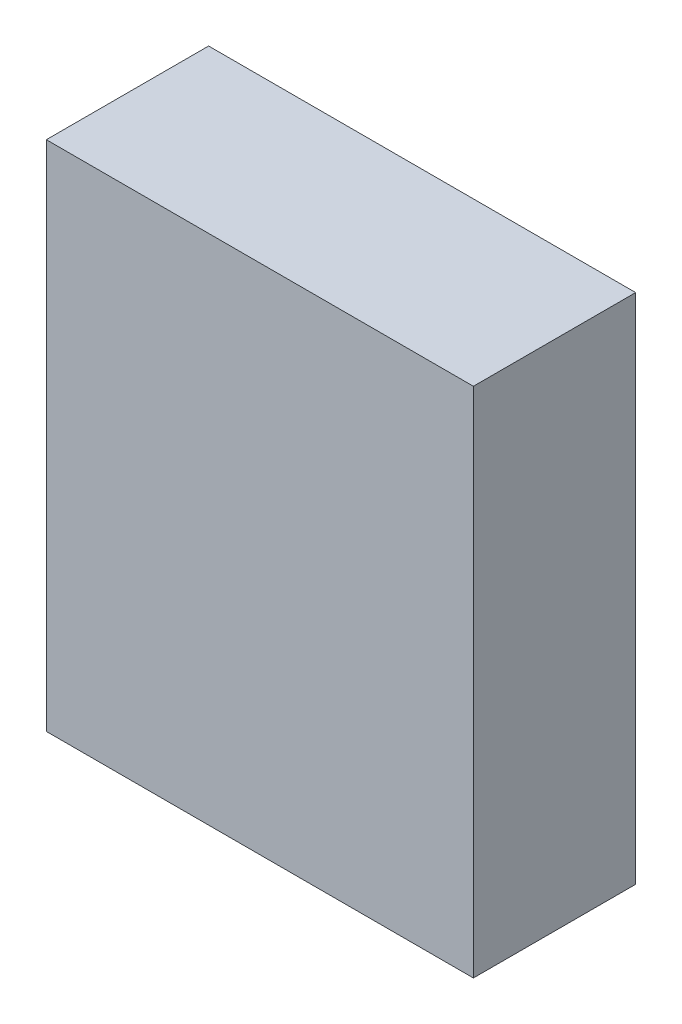
ISO-10303-21;
HEADER;
FILE_DESCRIPTION(('STEP AP214'),'2;1');
FILE_NAME('part.step','',(''),(''),'','','');
FILE_SCHEMA(('AUTOMOTIVE_DESIGN { 1 0 10303 214 1 1 1 1 }'));
ENDSEC;
DATA;
#1=APPLICATION_CONTEXT('core data for automotive mechanical design processes');
#2=APPLICATION_PROTOCOL_DEFINITION('international standard','automotive_design',2000,#1);
#3=PRODUCT_CONTEXT('',#1,'mechanical');
#4=PRODUCT('Part','Part','',(#3));
#5=PRODUCT_RELATED_PRODUCT_CATEGORY('part','',(#4));
#6=PRODUCT_DEFINITION_FORMATION('','',#4);
#7=PRODUCT_DEFINITION_CONTEXT('part definition',#1,'design');
#8=PRODUCT_DEFINITION('design','',#6,#7);
#9=PRODUCT_DEFINITION_SHAPE('','',#8);
#10=(LENGTH_UNIT() NAMED_UNIT(*) SI_UNIT(.MILLI.,.METRE.));
#11=(NAMED_UNIT(*) PLANE_ANGLE_UNIT() SI_UNIT($,.RADIAN.));
#12=(NAMED_UNIT(*) SI_UNIT($,.STERADIAN.) SOLID_ANGLE_UNIT());
#13=UNCERTAINTY_MEASURE_WITH_UNIT(LENGTH_MEASURE(1.E-05),#10,'distance_accuracy_value','');
#14=(GEOMETRIC_REPRESENTATION_CONTEXT(3) GLOBAL_UNCERTAINTY_ASSIGNED_CONTEXT((#13)) GLOBAL_UNIT_ASSIGNED_CONTEXT((#10,
#11,#12)) REPRESENTATION_CONTEXT('',''));
#15=CARTESIAN_POINT('',(0.,0.,0.));
#16=DIRECTION('',(0.,0.,1.));
#17=DIRECTION('',(1.,0.,0.));
#18=AXIS2_PLACEMENT_3D('',#15,#16,#17);
#19=CARTESIAN_POINT('',(-1.905,2.286,0.));
#20=DIRECTION('',(0.,0.,-1.));
#21=DIRECTION('',(-1.,0.,0.));
#22=AXIS2_PLACEMENT_3D('',#19,#20,#21);
#23=PLANE('',#22);
#24=DIRECTION('',(0.,1.,0.));
#25=VECTOR('',#24,1.);
#26=CARTESIAN_POINT('',(1.905,2.286,0.));
#27=LINE('',#26,#25);
#28=CARTESIAN_POINT('',(1.905,-2.286,0.));
#29=VERTEX_POINT('',#28);
#30=CARTESIAN_POINT('',(1.905,2.286,0.));
#31=VERTEX_POINT('',#30);
#32=EDGE_CURVE('E54',#29,#31,#27,.T.);
#33=ORIENTED_EDGE('',*,*,#32,.F.);
#34=DIRECTION('',(1.,0.,0.));
#35=VECTOR('',#34,1.);
#36=CARTESIAN_POINT('',(1.905,-2.286,0.));
#37=LINE('',#36,#35);
#38=CARTESIAN_POINT('',(-1.905,-2.286,0.));
#39=VERTEX_POINT('',#38);
#40=EDGE_CURVE('E19',#39,#29,#37,.T.);
#41=ORIENTED_EDGE('',*,*,#40,.F.);
#42=DIRECTION('',(0.,1.,0.));
#43=VECTOR('',#42,1.);
#44=CARTESIAN_POINT('',(-1.905,-2.286,0.));
#45=LINE('',#44,#43);
#46=CARTESIAN_POINT('',(-1.905,2.286,0.));
#47=VERTEX_POINT('',#46);
#48=EDGE_CURVE('E79',#47,#39,#45,.F.);
#49=ORIENTED_EDGE('',*,*,#48,.F.);
#50=DIRECTION('',(1.,0.,0.));
#51=VECTOR('',#50,1.);
#52=CARTESIAN_POINT('',(-1.905,2.286,0.));
#53=LINE('',#52,#51);
#54=EDGE_CURVE('E67',#31,#47,#53,.F.);
#55=ORIENTED_EDGE('',*,*,#54,.F.);
#56=EDGE_LOOP('',(#33,#41,#49,#55));
#57=FACE_BOUND('',#56,.T.);
#58=ADVANCED_FACE('F16',(#57),#23,.T.);
#59=CARTESIAN_POINT('',(1.905,-2.286,1.4478));
#60=DIRECTION('',(0.,-1.,0.));
#61=DIRECTION('',(0.,0.,-1.));
#62=AXIS2_PLACEMENT_3D('',#59,#60,#61);
#63=PLANE('',#62);
#64=ORIENTED_EDGE('',*,*,#40,.T.);
#65=DIRECTION('',(0.,0.,-1.));
#66=VECTOR('',#65,1.);
#67=CARTESIAN_POINT('',(1.905,-2.286,1.4478));
#68=LINE('',#67,#66);
#69=CARTESIAN_POINT('',(1.905,-2.286,1.4478));
#70=VERTEX_POINT('',#69);
#71=EDGE_CURVE('E60',#70,#29,#68,.T.);
#72=ORIENTED_EDGE('',*,*,#71,.F.);
#73=DIRECTION('',(1.,0.,0.));
#74=VECTOR('',#73,1.);
#75=CARTESIAN_POINT('',(-1.905,-2.286,1.4478));
#76=LINE('',#75,#74);
#77=CARTESIAN_POINT('',(-1.905,-2.286,1.4478));
#78=VERTEX_POINT('',#77);
#79=EDGE_CURVE('E82',#78,#70,#76,.T.);
#80=ORIENTED_EDGE('',*,*,#79,.F.);
#81=DIRECTION('',(0.,0.,1.));
#82=VECTOR('',#81,1.);
#83=CARTESIAN_POINT('',(-1.905,-2.286,1.4478));
#84=LINE('',#83,#82);
#85=EDGE_CURVE('E63',#39,#78,#84,.T.);
#86=ORIENTED_EDGE('',*,*,#85,.F.);
#87=EDGE_LOOP('',(#64,#72,#80,#86));
#88=FACE_BOUND('',#87,.T.);
#89=ADVANCED_FACE('F59',(#88),#63,.T.);
#90=CARTESIAN_POINT('',(1.905,2.286,1.4478));
#91=DIRECTION('',(1.,0.,0.));
#92=DIRECTION('',(0.,0.,-1.));
#93=AXIS2_PLACEMENT_3D('',#90,#91,#92);
#94=PLANE('',#93);
#95=ORIENTED_EDGE('',*,*,#32,.T.);
#96=DIRECTION('',(0.,0.,1.));
#97=VECTOR('',#96,1.);
#98=CARTESIAN_POINT('',(1.905,2.286,1.4478));
#99=LINE('',#98,#97);
#100=CARTESIAN_POINT('',(1.905,2.286,1.4478));
#101=VERTEX_POINT('',#100);
#102=EDGE_CURVE('E69',#101,#31,#99,.F.);
#103=ORIENTED_EDGE('',*,*,#102,.F.);
#104=DIRECTION('',(0.,1.,0.));
#105=VECTOR('',#104,1.);
#106=CARTESIAN_POINT('',(1.905,2.286,1.4478));
#107=LINE('',#106,#105);
#108=EDGE_CURVE('E73',#70,#101,#107,.T.);
#109=ORIENTED_EDGE('',*,*,#108,.F.);
#110=ORIENTED_EDGE('',*,*,#71,.T.);
#111=EDGE_LOOP('',(#95,#103,#109,#110));
#112=FACE_BOUND('',#111,.T.);
#113=ADVANCED_FACE('F71',(#112),#94,.T.);
#114=CARTESIAN_POINT('',(-1.905,2.286,1.4478));
#115=DIRECTION('',(0.,1.,0.));
#116=DIRECTION('',(0.,0.,1.));
#117=AXIS2_PLACEMENT_3D('',#114,#115,#116);
#118=PLANE('',#117);
#119=ORIENTED_EDGE('',*,*,#54,.T.);
#120=DIRECTION('',(0.,0.,1.));
#121=VECTOR('',#120,1.);
#122=CARTESIAN_POINT('',(-1.905,2.286,1.4478));
#123=LINE('',#122,#121);
#124=CARTESIAN_POINT('',(-1.905,2.286,1.4478));
#125=VERTEX_POINT('',#124);
#126=EDGE_CURVE('E34',#125,#47,#123,.F.);
#127=ORIENTED_EDGE('',*,*,#126,.F.);
#128=DIRECTION('',(1.,0.,0.));
#129=VECTOR('',#128,1.);
#130=CARTESIAN_POINT('',(-1.905,2.286,1.4478));
#131=LINE('',#130,#129);
#132=EDGE_CURVE('E25',#101,#125,#131,.F.);
#133=ORIENTED_EDGE('',*,*,#132,.F.);
#134=ORIENTED_EDGE('',*,*,#102,.T.);
#135=EDGE_LOOP('',(#119,#127,#133,#134));
#136=FACE_BOUND('',#135,.T.);
#137=ADVANCED_FACE('F88',(#136),#118,.T.);
#138=CARTESIAN_POINT('',(-1.905,-2.286,1.4478));
#139=DIRECTION('',(-1.,0.,0.));
#140=DIRECTION('',(0.,0.,1.));
#141=AXIS2_PLACEMENT_3D('',#138,#139,#140);
#142=PLANE('',#141);
#143=ORIENTED_EDGE('',*,*,#48,.T.);
#144=ORIENTED_EDGE('',*,*,#85,.T.);
#145=DIRECTION('',(0.,1.,0.));
#146=VECTOR('',#145,1.);
#147=CARTESIAN_POINT('',(-1.905,2.286,1.4478));
#148=LINE('',#147,#146);
#149=EDGE_CURVE('E11',#125,#78,#148,.F.);
#150=ORIENTED_EDGE('',*,*,#149,.F.);
#151=ORIENTED_EDGE('',*,*,#126,.T.);
#152=EDGE_LOOP('',(#143,#144,#150,#151));
#153=FACE_BOUND('',#152,.T.);
#154=ADVANCED_FACE('F90',(#153),#142,.T.);
#155=CARTESIAN_POINT('',(-1.905,2.286,1.4478));
#156=DIRECTION('',(0.,0.,1.));
#157=DIRECTION('',(1.,0.,0.));
#158=AXIS2_PLACEMENT_3D('',#155,#156,#157);
#159=PLANE('',#158);
#160=ORIENTED_EDGE('',*,*,#132,.T.);
#161=ORIENTED_EDGE('',*,*,#149,.T.);
#162=ORIENTED_EDGE('',*,*,#79,.T.);
#163=ORIENTED_EDGE('',*,*,#108,.T.);
#164=EDGE_LOOP('',(#160,#161,#162,#163));
#165=FACE_BOUND('',#164,.T.);
#166=ADVANCED_FACE('F87',(#165),#159,.T.);
#167=CLOSED_SHELL('',(#58,#89,#113,#137,#154,#166));
#168=MANIFOLD_SOLID_BREP('B1',#167);
#169=ADVANCED_BREP_SHAPE_REPRESENTATION('',(#18,#168),#14);
#170=SHAPE_DEFINITION_REPRESENTATION(#9,#169);
ENDSEC;
END-ISO-10303-21;
